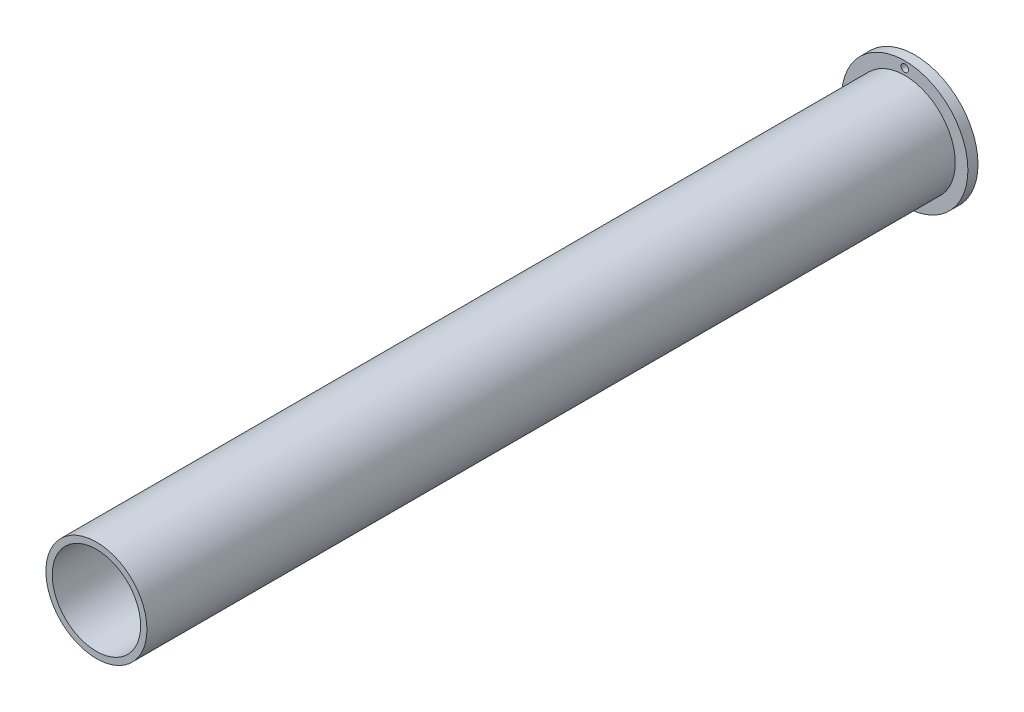
ISO-10303-21;
HEADER;
FILE_DESCRIPTION(('STEP AP214'),'2;1');
FILE_NAME('part.step','',(''),(''),'','','');
FILE_SCHEMA(('AUTOMOTIVE_DESIGN { 1 0 10303 214 1 1 1 1 }'));
ENDSEC;
DATA;
#1=APPLICATION_CONTEXT('core data for automotive mechanical design processes');
#2=APPLICATION_PROTOCOL_DEFINITION('international standard','automotive_design',2000,#1);
#3=PRODUCT_CONTEXT('',#1,'mechanical');
#4=PRODUCT('Part','Part','',(#3));
#5=PRODUCT_RELATED_PRODUCT_CATEGORY('part','',(#4));
#6=PRODUCT_DEFINITION_FORMATION('','',#4);
#7=PRODUCT_DEFINITION_CONTEXT('part definition',#1,'design');
#8=PRODUCT_DEFINITION('design','',#6,#7);
#9=PRODUCT_DEFINITION_SHAPE('','',#8);
#10=(LENGTH_UNIT() NAMED_UNIT(*) SI_UNIT(.MILLI.,.METRE.));
#11=(NAMED_UNIT(*) PLANE_ANGLE_UNIT() SI_UNIT($,.RADIAN.));
#12=(NAMED_UNIT(*) SI_UNIT($,.STERADIAN.) SOLID_ANGLE_UNIT());
#13=UNCERTAINTY_MEASURE_WITH_UNIT(LENGTH_MEASURE(1.E-05),#10,'distance_accuracy_value','');
#14=(GEOMETRIC_REPRESENTATION_CONTEXT(3) GLOBAL_UNCERTAINTY_ASSIGNED_CONTEXT((#13)) GLOBAL_UNIT_ASSIGNED_CONTEXT((#10,
#11,#12)) REPRESENTATION_CONTEXT('',''));
#15=CARTESIAN_POINT('',(0.,0.,0.));
#16=DIRECTION('',(0.,0.,1.));
#17=DIRECTION('',(1.,0.,0.));
#18=AXIS2_PLACEMENT_3D('',#15,#16,#17);
#19=CARTESIAN_POINT('',(0.,0.,2.54));
#20=DIRECTION('',(0.,0.,-1.));
#21=DIRECTION('',(-1.,0.,0.));
#22=AXIS2_PLACEMENT_3D('',#19,#20,#21);
#23=CYLINDRICAL_SURFACE('',#22,15.875);
#24=CARTESIAN_POINT('',(0.,0.,2.54));
#25=DIRECTION('',(0.,0.,1.));
#26=DIRECTION('',(1.,0.,0.));
#27=AXIS2_PLACEMENT_3D('',#24,#25,#26);
#28=CIRCLE('',#27,15.875);
#29=CARTESIAN_POINT('',(15.875,0.,2.54));
#30=VERTEX_POINT('',#29);
#31=EDGE_CURVE('E50',#30,#30,#28,.T.);
#32=ORIENTED_EDGE('',*,*,#31,.F.);
#33=EDGE_LOOP('',(#32));
#34=FACE_BOUND('',#33,.T.);
#35=CARTESIAN_POINT('',(0.,0.,0.));
#36=DIRECTION('',(0.,0.,1.));
#37=DIRECTION('',(1.,0.,0.));
#38=AXIS2_PLACEMENT_3D('',#35,#36,#37);
#39=CIRCLE('',#38,15.875);
#40=CARTESIAN_POINT('',(15.875,0.,0.));
#41=VERTEX_POINT('',#40);
#42=EDGE_CURVE('E55',#41,#41,#39,.T.);
#43=ORIENTED_EDGE('',*,*,#42,.T.);
#44=EDGE_LOOP('',(#43));
#45=FACE_BOUND('',#44,.T.);
#46=ADVANCED_FACE('F43',(#34,#45),#23,.T.);
#47=CARTESIAN_POINT('',(0.,0.,2.54));
#48=DIRECTION('',(0.,0.,1.));
#49=DIRECTION('',(1.,0.,0.));
#50=AXIS2_PLACEMENT_3D('',#47,#48,#49);
#51=PLANE('',#50);
#52=CARTESIAN_POINT('',(0.,14.2875,2.54));
#53=DIRECTION('',(0.,0.,1.));
#54=DIRECTION('',(1.,0.,0.));
#55=AXIS2_PLACEMENT_3D('',#52,#53,#54);
#56=CIRCLE('',#55,0.9271);
#57=CARTESIAN_POINT('',(0.9271,14.2875,2.54));
#58=VERTEX_POINT('',#57);
#59=EDGE_CURVE('E95',#58,#58,#56,.T.);
#60=ORIENTED_EDGE('',*,*,#59,.F.);
#61=EDGE_LOOP('',(#60));
#62=FACE_BOUND('',#61,.T.);
#63=CARTESIAN_POINT('',(0.,-14.2875,2.54));
#64=DIRECTION('',(0.,0.,1.));
#65=DIRECTION('',(-1.,0.,0.));
#66=AXIS2_PLACEMENT_3D('',#63,#64,#65);
#67=CIRCLE('',#66,0.9271);
#68=CARTESIAN_POINT('',(-0.9271,-14.2875,2.54));
#69=VERTEX_POINT('',#68);
#70=EDGE_CURVE('E91',#69,#69,#67,.T.);
#71=ORIENTED_EDGE('',*,*,#70,.F.);
#72=EDGE_LOOP('',(#71));
#73=FACE_BOUND('',#72,.T.);
#74=CARTESIAN_POINT('',(0.,0.,2.54));
#75=DIRECTION('',(0.,0.,1.));
#76=DIRECTION('',(1.,0.,0.));
#77=AXIS2_PLACEMENT_3D('',#74,#75,#76);
#78=CIRCLE('',#77,12.7);
#79=CARTESIAN_POINT('',(12.7,0.,2.54));
#80=VERTEX_POINT('',#79);
#81=EDGE_CURVE('E63',#80,#80,#78,.T.);
#82=ORIENTED_EDGE('',*,*,#81,.F.);
#83=EDGE_LOOP('',(#82));
#84=FACE_BOUND('',#83,.T.);
#85=ORIENTED_EDGE('',*,*,#31,.T.);
#86=EDGE_LOOP('',(#85));
#87=FACE_BOUND('',#86,.T.);
#88=ADVANCED_FACE('F109',(#62,#73,#84,#87),#51,.T.);
#89=CARTESIAN_POINT('',(0.,0.,0.));
#90=DIRECTION('',(0.,0.,1.));
#91=DIRECTION('',(1.,0.,0.));
#92=AXIS2_PLACEMENT_3D('',#89,#90,#91);
#93=PLANE('',#92);
#94=CARTESIAN_POINT('',(0.,14.2875,0.));
#95=DIRECTION('',(0.,0.,1.));
#96=DIRECTION('',(1.,0.,0.));
#97=AXIS2_PLACEMENT_3D('',#94,#95,#96);
#98=CIRCLE('',#97,0.9271);
#99=CARTESIAN_POINT('',(0.9271,14.2875,0.));
#100=VERTEX_POINT('',#99);
#101=EDGE_CURVE('E84',#100,#100,#98,.F.);
#102=ORIENTED_EDGE('',*,*,#101,.F.);
#103=EDGE_LOOP('',(#102));
#104=FACE_BOUND('',#103,.T.);
#105=CARTESIAN_POINT('',(0.,-14.2875,0.));
#106=DIRECTION('',(0.,0.,1.));
#107=DIRECTION('',(1.,0.,0.));
#108=AXIS2_PLACEMENT_3D('',#105,#106,#107);
#109=CIRCLE('',#108,0.9271);
#110=CARTESIAN_POINT('',(0.9271,-14.2875,0.));
#111=VERTEX_POINT('',#110);
#112=EDGE_CURVE('E96',#111,#111,#109,.F.);
#113=ORIENTED_EDGE('',*,*,#112,.F.);
#114=EDGE_LOOP('',(#113));
#115=FACE_BOUND('',#114,.T.);
#116=CARTESIAN_POINT('',(-8.128,0.,0.));
#117=DIRECTION('',(0.,0.,1.));
#118=DIRECTION('',(1.,0.,0.));
#119=AXIS2_PLACEMENT_3D('',#116,#117,#118);
#120=CIRCLE('',#119,1.778);
#121=CARTESIAN_POINT('',(-6.35,0.,0.));
#122=VERTEX_POINT('',#121);
#123=EDGE_CURVE('E74',#122,#122,#120,.F.);
#124=ORIENTED_EDGE('',*,*,#123,.F.);
#125=EDGE_LOOP('',(#124));
#126=FACE_BOUND('',#125,.T.);
#127=CARTESIAN_POINT('',(8.128,0.,0.));
#128=DIRECTION('',(0.,0.,1.));
#129=DIRECTION('',(1.,0.,0.));
#130=AXIS2_PLACEMENT_3D('',#127,#128,#129);
#131=CIRCLE('',#130,1.778);
#132=CARTESIAN_POINT('',(9.906,0.,0.));
#133=VERTEX_POINT('',#132);
#134=EDGE_CURVE('E80',#133,#133,#131,.F.);
#135=ORIENTED_EDGE('',*,*,#134,.F.);
#136=EDGE_LOOP('',(#135));
#137=FACE_BOUND('',#136,.T.);
#138=ORIENTED_EDGE('',*,*,#42,.F.);
#139=EDGE_LOOP('',(#138));
#140=FACE_BOUND('',#139,.T.);
#141=ADVANCED_FACE('F112',(#104,#115,#126,#137,#140),#93,.F.);
#142=CARTESIAN_POINT('',(0.,0.,205.74));
#143=DIRECTION('',(0.,0.,1.));
#144=DIRECTION('',(1.,0.,0.));
#145=AXIS2_PLACEMENT_3D('',#142,#143,#144);
#146=PLANE('',#145);
#147=CARTESIAN_POINT('',(0.,0.,205.74));
#148=DIRECTION('',(0.,0.,1.));
#149=DIRECTION('',(1.,0.,0.));
#150=AXIS2_PLACEMENT_3D('',#147,#148,#149);
#151=CIRCLE('',#150,12.7);
#152=CARTESIAN_POINT('',(12.7,0.,205.74));
#153=VERTEX_POINT('',#152);
#154=EDGE_CURVE('E61',#153,#153,#151,.T.);
#155=ORIENTED_EDGE('',*,*,#154,.T.);
#156=EDGE_LOOP('',(#155));
#157=FACE_BOUND('',#156,.T.);
#158=CARTESIAN_POINT('',(0.,0.,205.74));
#159=DIRECTION('',(0.,0.,1.));
#160=DIRECTION('',(1.,0.,0.));
#161=AXIS2_PLACEMENT_3D('',#158,#159,#160);
#162=CIRCLE('',#161,11.1125);
#163=CARTESIAN_POINT('',(11.1125,0.,205.74));
#164=VERTEX_POINT('',#163);
#165=EDGE_CURVE('E67',#164,#164,#162,.T.);
#166=ORIENTED_EDGE('',*,*,#165,.F.);
#167=EDGE_LOOP('',(#166));
#168=FACE_BOUND('',#167,.T.);
#169=ADVANCED_FACE('F122',(#157,#168),#146,.T.);
#170=CARTESIAN_POINT('',(0.,0.,205.74));
#171=DIRECTION('',(0.,0.,-1.));
#172=DIRECTION('',(-1.,0.,0.));
#173=AXIS2_PLACEMENT_3D('',#170,#171,#172);
#174=CYLINDRICAL_SURFACE('',#173,12.7);
#175=ORIENTED_EDGE('',*,*,#154,.F.);
#176=EDGE_LOOP('',(#175));
#177=FACE_BOUND('',#176,.T.);
#178=ORIENTED_EDGE('',*,*,#81,.T.);
#179=EDGE_LOOP('',(#178));
#180=FACE_BOUND('',#179,.T.);
#181=ADVANCED_FACE('F119',(#177,#180),#174,.T.);
#182=CARTESIAN_POINT('',(0.,0.,205.74));
#183=DIRECTION('',(0.,0.,-1.));
#184=DIRECTION('',(-1.,0.,0.));
#185=AXIS2_PLACEMENT_3D('',#182,#183,#184);
#186=CYLINDRICAL_SURFACE('',#185,11.1125);
#187=ORIENTED_EDGE('',*,*,#165,.T.);
#188=EDGE_LOOP('',(#187));
#189=FACE_BOUND('',#188,.T.);
#190=CARTESIAN_POINT('',(0.,0.,2.53999999999999));
#191=DIRECTION('',(0.,0.,1.));
#192=DIRECTION('',(1.,0.,0.));
#193=AXIS2_PLACEMENT_3D('',#190,#191,#192);
#194=CIRCLE('',#193,11.1125);
#195=CARTESIAN_POINT('',(11.1125,0.,2.53999999999999));
#196=VERTEX_POINT('',#195);
#197=EDGE_CURVE('E10',#196,#196,#194,.F.);
#198=ORIENTED_EDGE('',*,*,#197,.T.);
#199=EDGE_LOOP('',(#198));
#200=FACE_BOUND('',#199,.T.);
#201=ADVANCED_FACE('F121',(#189,#200),#186,.F.);
#202=CARTESIAN_POINT('',(-8.128,0.,2.54));
#203=DIRECTION('',(0.,0.,1.));
#204=DIRECTION('',(1.,0.,0.));
#205=AXIS2_PLACEMENT_3D('',#202,#203,#204);
#206=CIRCLE('',#205,1.778);
#207=CARTESIAN_POINT('',(-6.35,0.,2.54));
#208=VERTEX_POINT('',#207);
#209=EDGE_CURVE('E79',#208,#208,#206,.T.);
#210=ORIENTED_EDGE('',*,*,#209,.F.);
#211=EDGE_LOOP('',(#210));
#212=FACE_BOUND('',#211,.T.);
#213=CARTESIAN_POINT('',(8.128,0.,2.54));
#214=DIRECTION('',(0.,0.,1.));
#215=DIRECTION('',(-1.,0.,0.));
#216=AXIS2_PLACEMENT_3D('',#213,#214,#215);
#217=CIRCLE('',#216,1.778);
#218=CARTESIAN_POINT('',(6.35,0.,2.54));
#219=VERTEX_POINT('',#218);
#220=EDGE_CURVE('E75',#219,#219,#217,.T.);
#221=ORIENTED_EDGE('',*,*,#220,.F.);
#222=EDGE_LOOP('',(#221));
#223=FACE_BOUND('',#222,.T.);
#224=ORIENTED_EDGE('',*,*,#197,.F.);
#225=EDGE_LOOP('',(#224));
#226=FACE_BOUND('',#225,.T.);
#227=ADVANCED_FACE('F114',(#212,#223,#226),#51,.T.);
#228=CARTESIAN_POINT('',(8.128,0.,-5.02894342779872));
#229=DIRECTION('',(0.,0.,1.));
#230=DIRECTION('',(1.,0.,0.));
#231=AXIS2_PLACEMENT_3D('',#228,#229,#230);
#232=CYLINDRICAL_SURFACE('',#231,1.778);
#233=ORIENTED_EDGE('',*,*,#134,.T.);
#234=EDGE_LOOP('',(#233));
#235=FACE_BOUND('',#234,.T.);
#236=ORIENTED_EDGE('',*,*,#220,.T.);
#237=EDGE_LOOP('',(#236));
#238=FACE_BOUND('',#237,.T.);
#239=ADVANCED_FACE('F154',(#235,#238),#232,.F.);
#240=CARTESIAN_POINT('',(-8.128,0.,-5.02894342779872));
#241=DIRECTION('',(0.,0.,1.));
#242=DIRECTION('',(1.,0.,0.));
#243=AXIS2_PLACEMENT_3D('',#240,#241,#242);
#244=CYLINDRICAL_SURFACE('',#243,1.778);
#245=ORIENTED_EDGE('',*,*,#123,.T.);
#246=EDGE_LOOP('',(#245));
#247=FACE_BOUND('',#246,.T.);
#248=ORIENTED_EDGE('',*,*,#209,.T.);
#249=EDGE_LOOP('',(#248));
#250=FACE_BOUND('',#249,.T.);
#251=ADVANCED_FACE('F157',(#247,#250),#244,.F.);
#252=CARTESIAN_POINT('',(0.,-14.2875,-2.62223478735219));
#253=DIRECTION('',(0.,0.,1.));
#254=DIRECTION('',(1.,0.,0.));
#255=AXIS2_PLACEMENT_3D('',#252,#253,#254);
#256=CYLINDRICAL_SURFACE('',#255,0.9271);
#257=ORIENTED_EDGE('',*,*,#112,.T.);
#258=EDGE_LOOP('',(#257));
#259=FACE_BOUND('',#258,.T.);
#260=ORIENTED_EDGE('',*,*,#70,.T.);
#261=EDGE_LOOP('',(#260));
#262=FACE_BOUND('',#261,.T.);
#263=ADVANCED_FACE('F169',(#259,#262),#256,.F.);
#264=CARTESIAN_POINT('',(0.,14.2875,-2.62223478735219));
#265=DIRECTION('',(0.,0.,1.));
#266=DIRECTION('',(1.,0.,0.));
#267=AXIS2_PLACEMENT_3D('',#264,#265,#266);
#268=CYLINDRICAL_SURFACE('',#267,0.9271);
#269=ORIENTED_EDGE('',*,*,#101,.T.);
#270=EDGE_LOOP('',(#269));
#271=FACE_BOUND('',#270,.T.);
#272=ORIENTED_EDGE('',*,*,#59,.T.);
#273=EDGE_LOOP('',(#272));
#274=FACE_BOUND('',#273,.T.);
#275=ADVANCED_FACE('F107',(#271,#274),#268,.F.);
#276=CLOSED_SHELL('',(#46,#88,#141,#169,#181,#201,#227,#239,#251,#263,#275));
#277=MANIFOLD_SOLID_BREP('B2',#276);
#278=ADVANCED_BREP_SHAPE_REPRESENTATION('',(#18,#277),#14);
#279=SHAPE_DEFINITION_REPRESENTATION(#9,#278);
ENDSEC;
END-ISO-10303-21;
